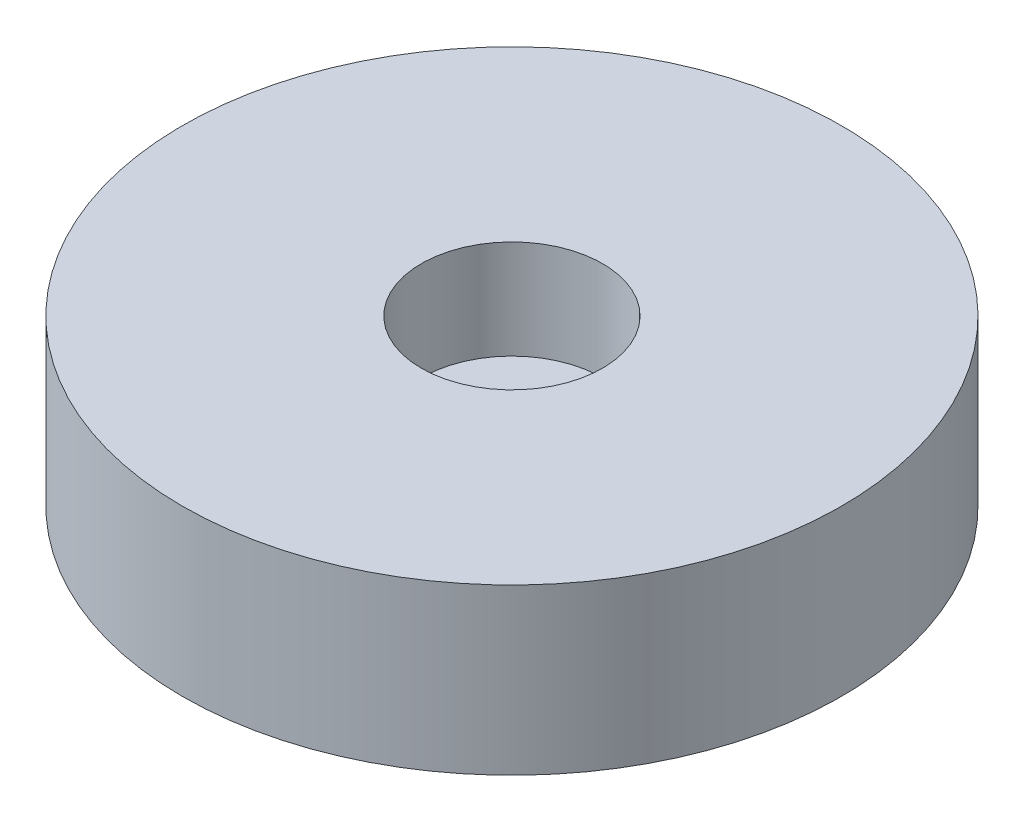
ISO-10303-21;
HEADER;
FILE_DESCRIPTION(('STEP AP214'),'2;1');
FILE_NAME('part.step','',(''),(''),'','','');
FILE_SCHEMA(('AUTOMOTIVE_DESIGN { 1 0 10303 214 1 1 1 1 }'));
ENDSEC;
DATA;
#1=APPLICATION_CONTEXT('core data for automotive mechanical design processes');
#2=APPLICATION_PROTOCOL_DEFINITION('international standard','automotive_design',2000,#1);
#3=PRODUCT_CONTEXT('',#1,'mechanical');
#4=PRODUCT('Part','Part','',(#3));
#5=PRODUCT_RELATED_PRODUCT_CATEGORY('part','',(#4));
#6=PRODUCT_DEFINITION_FORMATION('','',#4);
#7=PRODUCT_DEFINITION_CONTEXT('part definition',#1,'design');
#8=PRODUCT_DEFINITION('design','',#6,#7);
#9=PRODUCT_DEFINITION_SHAPE('','',#8);
#10=(LENGTH_UNIT() NAMED_UNIT(*) SI_UNIT(.MILLI.,.METRE.));
#11=(NAMED_UNIT(*) PLANE_ANGLE_UNIT() SI_UNIT($,.RADIAN.));
#12=(NAMED_UNIT(*) SI_UNIT($,.STERADIAN.) SOLID_ANGLE_UNIT());
#13=UNCERTAINTY_MEASURE_WITH_UNIT(LENGTH_MEASURE(1.E-05),#10,'distance_accuracy_value','');
#14=(GEOMETRIC_REPRESENTATION_CONTEXT(3) GLOBAL_UNCERTAINTY_ASSIGNED_CONTEXT((#13)) GLOBAL_UNIT_ASSIGNED_CONTEXT((#10,
#11,#12)) REPRESENTATION_CONTEXT('',''));
#15=CARTESIAN_POINT('',(0.,0.,0.));
#16=DIRECTION('',(0.,0.,1.));
#17=DIRECTION('',(1.,0.,0.));
#18=AXIS2_PLACEMENT_3D('',#15,#16,#17);
#19=CARTESIAN_POINT('',(0.,3.,0.));
#20=DIRECTION('',(0.,-1.,0.));
#21=DIRECTION('',(0.,0.,-1.));
#22=AXIS2_PLACEMENT_3D('',#19,#20,#21);
#23=CYLINDRICAL_SURFACE('',#22,6.);
#24=CARTESIAN_POINT('',(0.,3.,0.));
#25=DIRECTION('',(0.,1.,0.));
#26=DIRECTION('',(0.,0.,1.));
#27=AXIS2_PLACEMENT_3D('',#24,#25,#26);
#28=CIRCLE('',#27,6.);
#29=CARTESIAN_POINT('',(0.,3.,6.));
#30=VERTEX_POINT('',#29);
#31=EDGE_CURVE('E10',#30,#30,#28,.T.);
#32=ORIENTED_EDGE('',*,*,#31,.F.);
#33=EDGE_LOOP('',(#32));
#34=FACE_BOUND('',#33,.T.);
#35=CARTESIAN_POINT('',(0.,0.,0.));
#36=DIRECTION('',(0.,1.,0.));
#37=DIRECTION('',(0.,0.,1.));
#38=AXIS2_PLACEMENT_3D('',#35,#36,#37);
#39=CIRCLE('',#38,6.);
#40=CARTESIAN_POINT('',(0.,0.,6.));
#41=VERTEX_POINT('',#40);
#42=EDGE_CURVE('E46',#41,#41,#39,.T.);
#43=ORIENTED_EDGE('',*,*,#42,.T.);
#44=EDGE_LOOP('',(#43));
#45=FACE_BOUND('',#44,.T.);
#46=ADVANCED_FACE('F43',(#34,#45),#23,.T.);
#47=CARTESIAN_POINT('',(0.,3.,0.));
#48=DIRECTION('',(0.,1.,0.));
#49=DIRECTION('',(0.,0.,1.));
#50=AXIS2_PLACEMENT_3D('',#47,#48,#49);
#51=PLANE('',#50);
#52=CARTESIAN_POINT('',(0.,3.,0.));
#53=DIRECTION('',(0.,1.,0.));
#54=DIRECTION('',(0.,0.,1.));
#55=AXIS2_PLACEMENT_3D('',#52,#53,#54);
#56=CIRCLE('',#55,1.65);
#57=CARTESIAN_POINT('',(0.,3.,1.65));
#58=VERTEX_POINT('',#57);
#59=EDGE_CURVE('E57',#58,#58,#56,.T.);
#60=ORIENTED_EDGE('',*,*,#59,.F.);
#61=EDGE_LOOP('',(#60));
#62=FACE_BOUND('',#61,.T.);
#63=ORIENTED_EDGE('',*,*,#31,.T.);
#64=EDGE_LOOP('',(#63));
#65=FACE_BOUND('',#64,.T.);
#66=ADVANCED_FACE('F74',(#62,#65),#51,.T.);
#67=CARTESIAN_POINT('',(0.,0.,0.));
#68=DIRECTION('',(0.,1.,0.));
#69=DIRECTION('',(0.,0.,1.));
#70=AXIS2_PLACEMENT_3D('',#67,#68,#69);
#71=PLANE('',#70);
#72=ORIENTED_EDGE('',*,*,#42,.F.);
#73=EDGE_LOOP('',(#72));
#74=FACE_BOUND('',#73,.T.);
#75=ADVANCED_FACE('F70',(#74),#71,.F.);
#76=CARTESIAN_POINT('',(0.,1.2,0.));
#77=DIRECTION('',(0.,1.,0.));
#78=DIRECTION('',(0.,0.,1.));
#79=AXIS2_PLACEMENT_3D('',#76,#77,#78);
#80=CYLINDRICAL_SURFACE('',#79,1.65);
#81=CARTESIAN_POINT('',(0.,1.2,0.));
#82=DIRECTION('',(0.,1.,0.));
#83=DIRECTION('',(0.,0.,1.));
#84=AXIS2_PLACEMENT_3D('',#81,#82,#83);
#85=CIRCLE('',#84,1.65);
#86=CARTESIAN_POINT('',(0.,1.2,1.65));
#87=VERTEX_POINT('',#86);
#88=EDGE_CURVE('E55',#87,#87,#85,.T.);
#89=ORIENTED_EDGE('',*,*,#88,.F.);
#90=EDGE_LOOP('',(#89));
#91=FACE_BOUND('',#90,.T.);
#92=ORIENTED_EDGE('',*,*,#59,.T.);
#93=EDGE_LOOP('',(#92));
#94=FACE_BOUND('',#93,.T.);
#95=ADVANCED_FACE('F67',(#91,#94),#80,.F.);
#96=CARTESIAN_POINT('',(0.,1.2,0.));
#97=DIRECTION('',(0.,1.,0.));
#98=DIRECTION('',(0.,0.,1.));
#99=AXIS2_PLACEMENT_3D('',#96,#97,#98);
#100=PLANE('',#99);
#101=ORIENTED_EDGE('',*,*,#88,.T.);
#102=EDGE_LOOP('',(#101));
#103=FACE_BOUND('',#102,.T.);
#104=ADVANCED_FACE('F65',(#103),#100,.T.);
#105=CLOSED_SHELL('',(#46,#66,#75,#95,#104));
#106=MANIFOLD_SOLID_BREP('B2',#105);
#107=ADVANCED_BREP_SHAPE_REPRESENTATION('',(#18,#106),#14);
#108=SHAPE_DEFINITION_REPRESENTATION(#9,#107);
ENDSEC;
END-ISO-10303-21;
